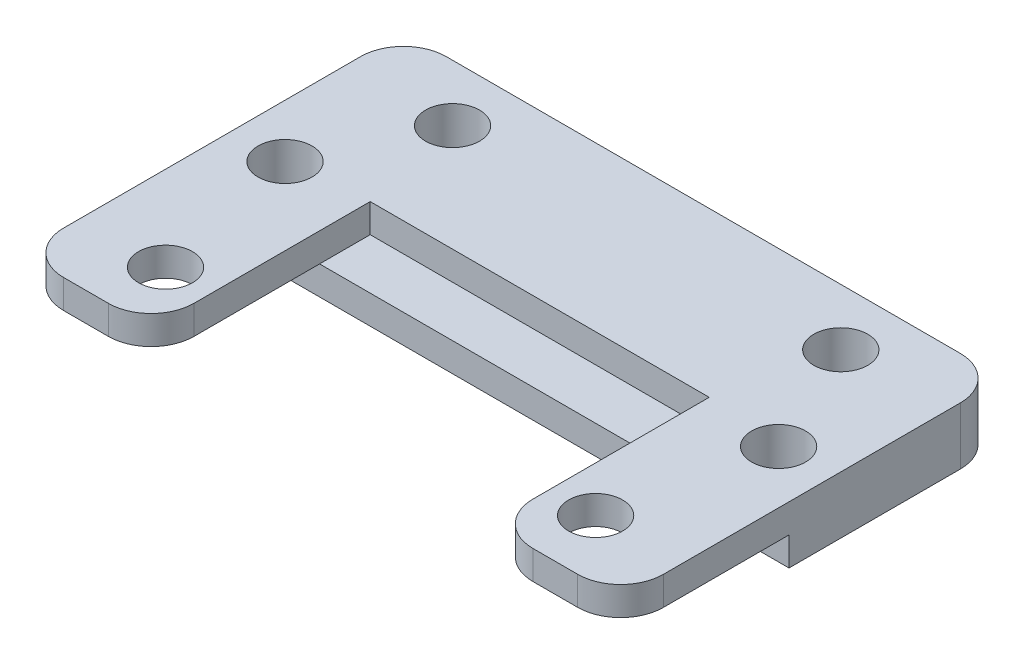
ISO-10303-21;
HEADER;
FILE_DESCRIPTION(('STEP AP214'),'2;1');
FILE_NAME('part.step','',(''),(''),'','','');
FILE_SCHEMA(('AUTOMOTIVE_DESIGN { 1 0 10303 214 1 1 1 1 }'));
ENDSEC;
DATA;
#1=APPLICATION_CONTEXT('core data for automotive mechanical design processes');
#2=APPLICATION_PROTOCOL_DEFINITION('international standard','automotive_design',2000,#1);
#3=PRODUCT_CONTEXT('',#1,'mechanical');
#4=PRODUCT('Part','Part','',(#3));
#5=PRODUCT_RELATED_PRODUCT_CATEGORY('part','',(#4));
#6=PRODUCT_DEFINITION_FORMATION('','',#4);
#7=PRODUCT_DEFINITION_CONTEXT('part definition',#1,'design');
#8=PRODUCT_DEFINITION('design','',#6,#7);
#9=PRODUCT_DEFINITION_SHAPE('','',#8);
#10=(LENGTH_UNIT() NAMED_UNIT(*) SI_UNIT(.MILLI.,.METRE.));
#11=(NAMED_UNIT(*) PLANE_ANGLE_UNIT() SI_UNIT($,.RADIAN.));
#12=(NAMED_UNIT(*) SI_UNIT($,.STERADIAN.) SOLID_ANGLE_UNIT());
#13=UNCERTAINTY_MEASURE_WITH_UNIT(LENGTH_MEASURE(1.E-05),#10,'distance_accuracy_value','');
#14=(GEOMETRIC_REPRESENTATION_CONTEXT(3) GLOBAL_UNCERTAINTY_ASSIGNED_CONTEXT((#13)) GLOBAL_UNIT_ASSIGNED_CONTEXT((#10,
#11,#12)) REPRESENTATION_CONTEXT('',''));
#15=CARTESIAN_POINT('',(0.,0.,0.));
#16=DIRECTION('',(0.,0.,1.));
#17=DIRECTION('',(1.,0.,0.));
#18=AXIS2_PLACEMENT_3D('',#15,#16,#17);
#19=CARTESIAN_POINT('',(83.6251306686558,84.3550258628715,169.432155684648));
#20=DIRECTION('',(0.,0.,-1.));
#21=DIRECTION('',(-1.,0.,0.));
#22=AXIS2_PLACEMENT_3D('',#19,#20,#21);
#23=PLANE('',#22);
#24=DIRECTION('',(-1.,0.,0.));
#25=VECTOR('',#24,1.);
#26=CARTESIAN_POINT('',(119.185130668656,82.6550258628715,169.432155684648));
#27=LINE('',#26,#25);
#28=CARTESIAN_POINT('',(119.185130668656,82.6550258628715,169.432155684648));
#29=VERTEX_POINT('',#28);
#30=CARTESIAN_POINT('',(111.455130668656,82.6550258628715,169.432155684648));
#31=VERTEX_POINT('',#30);
#32=EDGE_CURVE('E186',#29,#31,#27,.T.);
#33=ORIENTED_EDGE('',*,*,#32,.T.);
#34=DIRECTION('',(1.,0.,0.));
#35=VECTOR('',#34,1.);
#36=CARTESIAN_POINT('',(91.3551306686558,82.6550258628715,169.432155684648));
#37=LINE('',#36,#35);
#38=CARTESIAN_POINT('',(91.3551306686558,82.6550258628715,169.432155684648));
#39=VERTEX_POINT('',#38);
#40=EDGE_CURVE('E171',#39,#31,#37,.T.);
#41=ORIENTED_EDGE('',*,*,#40,.F.);
#42=DIRECTION('',(-1.,0.,0.));
#43=VECTOR('',#42,1.);
#44=CARTESIAN_POINT('',(83.6251306686558,82.6550258628715,169.432155684648));
#45=LINE('',#44,#43);
#46=CARTESIAN_POINT('',(83.6251306686558,82.6550258628715,169.432155684648));
#47=VERTEX_POINT('',#46);
#48=EDGE_CURVE('E183',#39,#47,#45,.T.);
#49=ORIENTED_EDGE('',*,*,#48,.T.);
#50=DIRECTION('',(0.,-1.,0.));
#51=VECTOR('',#50,1.);
#52=CARTESIAN_POINT('',(83.6251306686558,84.3550258628715,169.432155684648));
#53=LINE('',#52,#51);
#54=CARTESIAN_POINT('',(83.6251306686558,80.9550258628715,169.432155684648));
#55=VERTEX_POINT('',#54);
#56=EDGE_CURVE('E305',#47,#55,#53,.T.);
#57=ORIENTED_EDGE('',*,*,#56,.T.);
#58=DIRECTION('',(1.,0.,0.));
#59=VECTOR('',#58,1.);
#60=CARTESIAN_POINT('',(83.6251306686558,80.9550258628715,169.432155684648));
#61=LINE('',#60,#59);
#62=CARTESIAN_POINT('',(119.185130668656,80.9550258628715,169.432155684648));
#63=VERTEX_POINT('',#62);
#64=EDGE_CURVE('E271',#55,#63,#61,.T.);
#65=ORIENTED_EDGE('',*,*,#64,.T.);
#66=DIRECTION('',(0.,-1.,0.));
#67=VECTOR('',#66,1.);
#68=CARTESIAN_POINT('',(119.185130668656,84.3550258628715,169.432155684648));
#69=LINE('',#68,#67);
#70=EDGE_CURVE('E283',#29,#63,#69,.T.);
#71=ORIENTED_EDGE('',*,*,#70,.F.);
#72=EDGE_LOOP('',(#33,#41,#49,#57,#65,#71));
#73=FACE_BOUND('',#72,.T.);
#74=ADVANCED_FACE('F45',(#73),#23,.F.);
#75=CARTESIAN_POINT('',(86.1651306686558,84.3550258628715,159.272155684648));
#76=DIRECTION('',(0.,1.,0.));
#77=DIRECTION('',(0.,0.,1.));
#78=AXIS2_PLACEMENT_3D('',#75,#76,#77);
#79=PLANE('',#78);
#80=DIRECTION('',(0.,0.,-1.));
#81=VECTOR('',#80,1.);
#82=CARTESIAN_POINT('',(91.3551306686558,84.3550258628715,169.432155684648));
#83=LINE('',#82,#81);
#84=CARTESIAN_POINT('',(91.3551306686558,84.3550258628715,176.877155684648));
#85=VERTEX_POINT('',#84);
#86=CARTESIAN_POINT('',(91.3551306686558,84.3550258628715,166.432155684648));
#87=VERTEX_POINT('',#86);
#88=EDGE_CURVE('E223',#85,#87,#83,.T.);
#89=ORIENTED_EDGE('',*,*,#88,.T.);
#90=DIRECTION('',(-1.,0.,0.));
#91=VECTOR('',#90,1.);
#92=CARTESIAN_POINT('',(91.3551306686558,84.3550258628715,166.432155684648));
#93=LINE('',#92,#91);
#94=CARTESIAN_POINT('',(111.455130668656,84.3550258628715,166.432155684648));
#95=VERTEX_POINT('',#94);
#96=EDGE_CURVE('E179',#95,#87,#93,.T.);
#97=ORIENTED_EDGE('',*,*,#96,.F.);
#98=DIRECTION('',(0.,0.,1.));
#99=VECTOR('',#98,1.);
#100=CARTESIAN_POINT('',(111.455130668656,84.3550258628715,169.432155684648));
#101=LINE('',#100,#99);
#102=CARTESIAN_POINT('',(111.455130668656,84.3550258628715,176.877155684647));
#103=VERTEX_POINT('',#102);
#104=EDGE_CURVE('E633',#95,#103,#101,.T.);
#105=ORIENTED_EDGE('',*,*,#104,.T.);
#106=CARTESIAN_POINT('',(113.995130668656,84.3550258628715,176.877155684647));
#107=DIRECTION('',(0.,1.,0.));
#108=DIRECTION('',(0.,0.,-1.));
#109=AXIS2_PLACEMENT_3D('',#106,#107,#108);
#110=CIRCLE('',#109,2.53999999999999);
#111=CARTESIAN_POINT('',(113.995130668656,84.3550258628715,179.417155684647));
#112=VERTEX_POINT('',#111);
#113=EDGE_CURVE('E661',#103,#112,#110,.T.);
#114=ORIENTED_EDGE('',*,*,#113,.T.);
#115=DIRECTION('',(1.,0.,0.));
#116=VECTOR('',#115,1.);
#117=CARTESIAN_POINT('',(116.645130668656,84.3550258628715,179.417155684647));
#118=LINE('',#117,#116);
#119=CARTESIAN_POINT('',(116.645130668656,84.3550258628715,179.417155684647));
#120=VERTEX_POINT('',#119);
#121=EDGE_CURVE('E665',#112,#120,#118,.T.);
#122=ORIENTED_EDGE('',*,*,#121,.T.);
#123=CARTESIAN_POINT('',(116.645130668656,84.3550258628715,176.877155684647));
#124=DIRECTION('',(0.,1.,0.));
#125=DIRECTION('',(0.,0.,-1.));
#126=AXIS2_PLACEMENT_3D('',#123,#124,#125);
#127=CIRCLE('',#126,2.53999999999999);
#128=CARTESIAN_POINT('',(119.185130668656,84.3550258628715,176.877155684647));
#129=VERTEX_POINT('',#128);
#130=EDGE_CURVE('E638',#120,#129,#127,.T.);
#131=ORIENTED_EDGE('',*,*,#130,.T.);
#132=DIRECTION('',(0.,0.,-1.));
#133=VECTOR('',#132,1.);
#134=CARTESIAN_POINT('',(119.185130668656,84.3550258628715,159.272155684648));
#135=LINE('',#134,#133);
#136=CARTESIAN_POINT('',(119.185130668656,84.3550258628715,159.272155684648));
#137=VERTEX_POINT('',#136);
#138=EDGE_CURVE('E266',#129,#137,#135,.T.);
#139=ORIENTED_EDGE('',*,*,#138,.T.);
#140=CARTESIAN_POINT('',(116.645130668656,84.3550258628715,159.272155684648));
#141=DIRECTION('',(0.,1.,0.));
#142=DIRECTION('',(0.,0.,-1.));
#143=AXIS2_PLACEMENT_3D('',#140,#141,#142);
#144=CIRCLE('',#143,2.53999999999999);
#145=CARTESIAN_POINT('',(116.645130668656,84.3550258628715,156.732155684648));
#146=VERTEX_POINT('',#145);
#147=EDGE_CURVE('E270',#137,#146,#144,.T.);
#148=ORIENTED_EDGE('',*,*,#147,.T.);
#149=DIRECTION('',(-1.,0.,0.));
#150=VECTOR('',#149,1.);
#151=CARTESIAN_POINT('',(86.1651306686558,84.3550258628715,156.732155684648));
#152=LINE('',#151,#150);
#153=CARTESIAN_POINT('',(86.1651306686558,84.3550258628715,156.732155684648));
#154=VERTEX_POINT('',#153);
#155=EDGE_CURVE('E274',#146,#154,#152,.T.);
#156=ORIENTED_EDGE('',*,*,#155,.T.);
#157=CARTESIAN_POINT('',(86.1651306686558,84.3550258628715,159.272155684648));
#158=DIRECTION('',(0.,1.,0.));
#159=DIRECTION('',(0.,0.,1.));
#160=AXIS2_PLACEMENT_3D('',#157,#158,#159);
#161=CIRCLE('',#160,2.53999999999999);
#162=CARTESIAN_POINT('',(83.6251306686558,84.3550258628715,159.272155684648));
#163=VERTEX_POINT('',#162);
#164=EDGE_CURVE('E277',#154,#163,#161,.T.);
#165=ORIENTED_EDGE('',*,*,#164,.T.);
#166=DIRECTION('',(0.,0.,1.));
#167=VECTOR('',#166,1.);
#168=CARTESIAN_POINT('',(83.6251306686558,84.3550258628715,159.272155684648));
#169=LINE('',#168,#167);
#170=CARTESIAN_POINT('',(83.6251306686558,84.3550258628715,176.877155684648));
#171=VERTEX_POINT('',#170);
#172=EDGE_CURVE('E280',#163,#171,#169,.T.);
#173=ORIENTED_EDGE('',*,*,#172,.T.);
#174=CARTESIAN_POINT('',(86.1651306686558,84.3550258628715,176.877155684648));
#175=DIRECTION('',(0.,1.,0.));
#176=DIRECTION('',(0.,0.,1.));
#177=AXIS2_PLACEMENT_3D('',#174,#175,#176);
#178=CIRCLE('',#177,2.53999999999999);
#179=CARTESIAN_POINT('',(86.1651306686558,84.3550258628715,179.417155684648));
#180=VERTEX_POINT('',#179);
#181=EDGE_CURVE('E210',#171,#180,#178,.T.);
#182=ORIENTED_EDGE('',*,*,#181,.T.);
#183=DIRECTION('',(1.,0.,0.));
#184=VECTOR('',#183,1.);
#185=CARTESIAN_POINT('',(86.1651306686558,84.3550258628715,179.417155684648));
#186=LINE('',#185,#184);
#187=CARTESIAN_POINT('',(88.8151306686558,84.3550258628715,179.417155684648));
#188=VERTEX_POINT('',#187);
#189=EDGE_CURVE('E214',#180,#188,#186,.T.);
#190=ORIENTED_EDGE('',*,*,#189,.T.);
#191=CARTESIAN_POINT('',(88.8151306686558,84.3550258628715,176.877155684648));
#192=DIRECTION('',(0.,1.,0.));
#193=DIRECTION('',(0.,0.,1.));
#194=AXIS2_PLACEMENT_3D('',#191,#192,#193);
#195=CIRCLE('',#194,2.53999999999999);
#196=EDGE_CURVE('E219',#188,#85,#195,.T.);
#197=ORIENTED_EDGE('',*,*,#196,.T.);
#198=EDGE_LOOP('',(#89,#97,#105,#114,#122,#131,#139,#148,#156,#165,#173,#182,#190,#197));
#199=FACE_BOUND('',#198,.T.);
#200=CARTESIAN_POINT('',(89.8955117254591,84.3550258628715,160.09007966282));
#201=DIRECTION('',(0.,1.,0.));
#202=DIRECTION('',(0.,0.,1.));
#203=AXIS2_PLACEMENT_3D('',#200,#201,#202);
#204=CIRCLE('',#203,1.60000000000002);
#205=CARTESIAN_POINT('',(89.8955117254591,84.3550258628715,161.69007966282));
#206=VERTEX_POINT('',#205);
#207=EDGE_CURVE('E242',#206,#206,#204,.T.);
#208=ORIENTED_EDGE('',*,*,#207,.F.);
#209=EDGE_LOOP('',(#208));
#210=FACE_BOUND('',#209,.T.);
#211=CARTESIAN_POINT('',(116.036904819902,84.3550258628715,166.898975693062));
#212=DIRECTION('',(0.,1.,0.));
#213=DIRECTION('',(0.,0.,1.));
#214=AXIS2_PLACEMENT_3D('',#211,#212,#213);
#215=CIRCLE('',#214,1.59999999999999);
#216=CARTESIAN_POINT('',(116.036904819902,84.3550258628715,168.498975693062));
#217=VERTEX_POINT('',#216);
#218=EDGE_CURVE('E258',#217,#217,#215,.T.);
#219=ORIENTED_EDGE('',*,*,#218,.F.);
#220=EDGE_LOOP('',(#219));
#221=FACE_BOUND('',#220,.T.);
#222=CARTESIAN_POINT('',(112.914749611926,84.3550258628715,160.09007966282));
#223=DIRECTION('',(0.,1.,0.));
#224=DIRECTION('',(0.,0.,1.));
#225=AXIS2_PLACEMENT_3D('',#222,#223,#224);
#226=CIRCLE('',#225,1.60000000000002);
#227=CARTESIAN_POINT('',(112.914749611926,84.3550258628715,161.69007966282));
#228=VERTEX_POINT('',#227);
#229=EDGE_CURVE('E250',#228,#228,#226,.T.);
#230=ORIENTED_EDGE('',*,*,#229,.F.);
#231=EDGE_LOOP('',(#230));
#232=FACE_BOUND('',#231,.T.);
#233=CARTESIAN_POINT('',(86.7733565174829,84.3550258628715,166.898975693063));
#234=DIRECTION('',(0.,1.,0.));
#235=DIRECTION('',(0.,0.,1.));
#236=AXIS2_PLACEMENT_3D('',#233,#234,#235);
#237=CIRCLE('',#236,1.59999999999999);
#238=CARTESIAN_POINT('',(86.7733565174829,84.3550258628715,168.498975693063));
#239=VERTEX_POINT('',#238);
#240=EDGE_CURVE('E234',#239,#239,#237,.T.);
#241=ORIENTED_EDGE('',*,*,#240,.F.);
#242=EDGE_LOOP('',(#241));
#243=FACE_BOUND('',#242,.T.);
#244=CARTESIAN_POINT('',(88.6551306686557,84.3550258628715,175.867155684648));
#245=DIRECTION('',(0.,1.,0.));
#246=DIRECTION('',(0.,0.,1.));
#247=AXIS2_PLACEMENT_3D('',#244,#245,#246);
#248=CIRCLE('',#247,1.59999999999999);
#249=CARTESIAN_POINT('',(88.6551306686557,84.3550258628715,177.467155684648));
#250=VERTEX_POINT('',#249);
#251=EDGE_CURVE('E353',#250,#250,#248,.T.);
#252=ORIENTED_EDGE('',*,*,#251,.F.);
#253=EDGE_LOOP('',(#252));
#254=FACE_BOUND('',#253,.T.);
#255=CARTESIAN_POINT('',(114.155130668656,84.3550258628715,175.867155684648));
#256=DIRECTION('',(0.,1.,0.));
#257=DIRECTION('',(0.,0.,1.));
#258=AXIS2_PLACEMENT_3D('',#255,#256,#257);
#259=CIRCLE('',#258,1.6);
#260=CARTESIAN_POINT('',(114.155130668656,84.3550258628715,177.467155684648));
#261=VERTEX_POINT('',#260);
#262=EDGE_CURVE('E623',#261,#261,#259,.T.);
#263=ORIENTED_EDGE('',*,*,#262,.F.);
#264=EDGE_LOOP('',(#263));
#265=FACE_BOUND('',#264,.T.);
#266=ADVANCED_FACE('F340',(#199,#210,#221,#232,#243,#254,#265),#79,.T.);
#267=CARTESIAN_POINT('',(86.1651306686558,80.9550258628715,159.272155684648));
#268=DIRECTION('',(0.,1.,0.));
#269=DIRECTION('',(0.,0.,1.));
#270=AXIS2_PLACEMENT_3D('',#267,#268,#269);
#271=PLANE('',#270);
#272=DIRECTION('',(0.,0.,-1.));
#273=VECTOR('',#272,1.);
#274=CARTESIAN_POINT('',(119.185130668656,80.9550258628715,159.272155684648));
#275=LINE('',#274,#273);
#276=CARTESIAN_POINT('',(119.185130668656,80.9550258628715,159.272155684648));
#277=VERTEX_POINT('',#276);
#278=EDGE_CURVE('E262',#63,#277,#275,.T.);
#279=ORIENTED_EDGE('',*,*,#278,.F.);
#280=ORIENTED_EDGE('',*,*,#64,.F.);
#281=DIRECTION('',(0.,0.,1.));
#282=VECTOR('',#281,1.);
#283=CARTESIAN_POINT('',(83.6251306686558,80.9550258628715,159.272155684648));
#284=LINE('',#283,#282);
#285=CARTESIAN_POINT('',(83.6251306686558,80.9550258628715,159.272155684648));
#286=VERTEX_POINT('',#285);
#287=EDGE_CURVE('E296',#286,#55,#284,.T.);
#288=ORIENTED_EDGE('',*,*,#287,.F.);
#289=CARTESIAN_POINT('',(86.1651306686558,80.9550258628715,159.272155684648));
#290=DIRECTION('',(0.,1.,0.));
#291=DIRECTION('',(0.,0.,1.));
#292=AXIS2_PLACEMENT_3D('',#289,#290,#291);
#293=CIRCLE('',#292,2.53999999999999);
#294=CARTESIAN_POINT('',(86.1651306686558,80.9550258628715,156.732155684648));
#295=VERTEX_POINT('',#294);
#296=EDGE_CURVE('E293',#295,#286,#293,.T.);
#297=ORIENTED_EDGE('',*,*,#296,.F.);
#298=DIRECTION('',(-1.,0.,0.));
#299=VECTOR('',#298,1.);
#300=CARTESIAN_POINT('',(86.1651306686558,80.9550258628715,156.732155684648));
#301=LINE('',#300,#299);
#302=CARTESIAN_POINT('',(116.645130668656,80.9550258628715,156.732155684648));
#303=VERTEX_POINT('',#302);
#304=EDGE_CURVE('E290',#303,#295,#301,.T.);
#305=ORIENTED_EDGE('',*,*,#304,.F.);
#306=CARTESIAN_POINT('',(116.645130668656,80.9550258628715,159.272155684648));
#307=DIRECTION('',(0.,1.,0.));
#308=DIRECTION('',(0.,0.,-1.));
#309=AXIS2_PLACEMENT_3D('',#306,#307,#308);
#310=CIRCLE('',#309,2.53999999999999);
#311=EDGE_CURVE('E287',#277,#303,#310,.T.);
#312=ORIENTED_EDGE('',*,*,#311,.F.);
#313=EDGE_LOOP('',(#279,#280,#288,#297,#305,#312));
#314=FACE_BOUND('',#313,.T.);
#315=CARTESIAN_POINT('',(116.036904819902,80.9550258628715,166.898975693062));
#316=DIRECTION('',(0.,1.,0.));
#317=DIRECTION('',(0.,0.,1.));
#318=AXIS2_PLACEMENT_3D('',#315,#316,#317);
#319=CIRCLE('',#318,1.59999999999999);
#320=CARTESIAN_POINT('',(116.036904819902,80.9550258628715,168.498975693062));
#321=VERTEX_POINT('',#320);
#322=EDGE_CURVE('E254',#321,#321,#319,.T.);
#323=ORIENTED_EDGE('',*,*,#322,.T.);
#324=EDGE_LOOP('',(#323));
#325=FACE_BOUND('',#324,.T.);
#326=CARTESIAN_POINT('',(112.914749611926,80.9550258628715,160.09007966282));
#327=DIRECTION('',(0.,1.,0.));
#328=DIRECTION('',(0.,0.,1.));
#329=AXIS2_PLACEMENT_3D('',#326,#327,#328);
#330=CIRCLE('',#329,1.60000000000002);
#331=CARTESIAN_POINT('',(112.914749611926,80.9550258628715,161.69007966282));
#332=VERTEX_POINT('',#331);
#333=EDGE_CURVE('E246',#332,#332,#330,.T.);
#334=ORIENTED_EDGE('',*,*,#333,.T.);
#335=EDGE_LOOP('',(#334));
#336=FACE_BOUND('',#335,.T.);
#337=CARTESIAN_POINT('',(89.8955117254591,80.9550258628715,160.09007966282));
#338=DIRECTION('',(0.,1.,0.));
#339=DIRECTION('',(0.,0.,1.));
#340=AXIS2_PLACEMENT_3D('',#337,#338,#339);
#341=CIRCLE('',#340,1.60000000000002);
#342=CARTESIAN_POINT('',(89.8955117254591,80.9550258628715,161.69007966282));
#343=VERTEX_POINT('',#342);
#344=EDGE_CURVE('E238',#343,#343,#341,.T.);
#345=ORIENTED_EDGE('',*,*,#344,.T.);
#346=EDGE_LOOP('',(#345));
#347=FACE_BOUND('',#346,.T.);
#348=CARTESIAN_POINT('',(86.7733565174829,80.9550258628715,166.898975693063));
#349=DIRECTION('',(0.,1.,0.));
#350=DIRECTION('',(0.,0.,1.));
#351=AXIS2_PLACEMENT_3D('',#348,#349,#350);
#352=CIRCLE('',#351,1.59999999999999);
#353=CARTESIAN_POINT('',(86.7733565174829,80.9550258628715,168.498975693063));
#354=VERTEX_POINT('',#353);
#355=EDGE_CURVE('E228',#354,#354,#352,.T.);
#356=ORIENTED_EDGE('',*,*,#355,.T.);
#357=EDGE_LOOP('',(#356));
#358=FACE_BOUND('',#357,.T.);
#359=ADVANCED_FACE('F327',(#314,#325,#336,#347,#358),#271,.F.);
#360=CARTESIAN_POINT('',(119.185130668656,84.3550258628715,159.272155684648));
#361=DIRECTION('',(-1.,0.,0.));
#362=DIRECTION('',(0.,0.,1.));
#363=AXIS2_PLACEMENT_3D('',#360,#361,#362);
#364=PLANE('',#363);
#365=ORIENTED_EDGE('',*,*,#278,.T.);
#366=DIRECTION('',(0.,-1.,0.));
#367=VECTOR('',#366,1.);
#368=CARTESIAN_POINT('',(119.185130668656,84.3550258628715,159.272155684648));
#369=LINE('',#368,#367);
#370=EDGE_CURVE('E11',#137,#277,#369,.T.);
#371=ORIENTED_EDGE('',*,*,#370,.F.);
#372=ORIENTED_EDGE('',*,*,#138,.F.);
#373=DIRECTION('',(0.,1.,0.));
#374=VECTOR('',#373,1.);
#375=CARTESIAN_POINT('',(119.185130668656,82.6550258628715,176.877155684647));
#376=LINE('',#375,#374);
#377=CARTESIAN_POINT('',(119.185130668656,82.6550258628715,176.877155684647));
#378=VERTEX_POINT('',#377);
#379=EDGE_CURVE('E671',#378,#129,#376,.T.);
#380=ORIENTED_EDGE('',*,*,#379,.F.);
#381=DIRECTION('',(0.,0.,-1.));
#382=VECTOR('',#381,1.);
#383=CARTESIAN_POINT('',(119.185130668656,82.6550258628715,169.432155684648));
#384=LINE('',#383,#382);
#385=EDGE_CURVE('E61',#378,#29,#384,.T.);
#386=ORIENTED_EDGE('',*,*,#385,.T.);
#387=ORIENTED_EDGE('',*,*,#70,.T.);
#388=EDGE_LOOP('',(#365,#371,#372,#380,#386,#387));
#389=FACE_BOUND('',#388,.T.);
#390=ADVANCED_FACE('F47',(#389),#364,.F.);
#391=CARTESIAN_POINT('',(116.645130668656,84.3550258628715,159.272155684648));
#392=DIRECTION('',(0.,-1.,0.));
#393=DIRECTION('',(0.,0.,-1.));
#394=AXIS2_PLACEMENT_3D('',#391,#392,#393);
#395=CYLINDRICAL_SURFACE('',#394,2.53999999999999);
#396=ORIENTED_EDGE('',*,*,#311,.T.);
#397=DIRECTION('',(0.,-1.,0.));
#398=VECTOR('',#397,1.);
#399=CARTESIAN_POINT('',(116.645130668656,84.3550258628715,156.732155684648));
#400=LINE('',#399,#398);
#401=EDGE_CURVE('E54',#146,#303,#400,.T.);
#402=ORIENTED_EDGE('',*,*,#401,.F.);
#403=ORIENTED_EDGE('',*,*,#147,.F.);
#404=ORIENTED_EDGE('',*,*,#370,.T.);
#405=EDGE_LOOP('',(#396,#402,#403,#404));
#406=FACE_BOUND('',#405,.T.);
#407=ADVANCED_FACE('F344',(#406),#395,.T.);
#408=CARTESIAN_POINT('',(86.1651306686558,84.3550258628715,156.732155684648));
#409=DIRECTION('',(0.,0.,1.));
#410=DIRECTION('',(1.,0.,0.));
#411=AXIS2_PLACEMENT_3D('',#408,#409,#410);
#412=PLANE('',#411);
#413=ORIENTED_EDGE('',*,*,#304,.T.);
#414=DIRECTION('',(0.,-1.,0.));
#415=VECTOR('',#414,1.);
#416=CARTESIAN_POINT('',(86.1651306686558,84.3550258628715,156.732155684648));
#417=LINE('',#416,#415);
#418=EDGE_CURVE('E312',#154,#295,#417,.T.);
#419=ORIENTED_EDGE('',*,*,#418,.F.);
#420=ORIENTED_EDGE('',*,*,#155,.F.);
#421=ORIENTED_EDGE('',*,*,#401,.T.);
#422=EDGE_LOOP('',(#413,#419,#420,#421));
#423=FACE_BOUND('',#422,.T.);
#424=ADVANCED_FACE('F321',(#423),#412,.F.);
#425=CARTESIAN_POINT('',(86.1651306686558,84.3550258628715,159.272155684648));
#426=DIRECTION('',(0.,-1.,0.));
#427=DIRECTION('',(0.,0.,-1.));
#428=AXIS2_PLACEMENT_3D('',#425,#426,#427);
#429=CYLINDRICAL_SURFACE('',#428,2.53999999999999);
#430=ORIENTED_EDGE('',*,*,#296,.T.);
#431=DIRECTION('',(0.,-1.,0.));
#432=VECTOR('',#431,1.);
#433=CARTESIAN_POINT('',(83.6251306686558,84.3550258628715,159.272155684648));
#434=LINE('',#433,#432);
#435=EDGE_CURVE('E308',#163,#286,#434,.T.);
#436=ORIENTED_EDGE('',*,*,#435,.F.);
#437=ORIENTED_EDGE('',*,*,#164,.F.);
#438=ORIENTED_EDGE('',*,*,#418,.T.);
#439=EDGE_LOOP('',(#430,#436,#437,#438));
#440=FACE_BOUND('',#439,.T.);
#441=ADVANCED_FACE('F333',(#440),#429,.T.);
#442=CARTESIAN_POINT('',(83.6251306686558,84.3550258628715,159.272155684648));
#443=DIRECTION('',(1.,0.,0.));
#444=DIRECTION('',(0.,0.,-1.));
#445=AXIS2_PLACEMENT_3D('',#442,#443,#444);
#446=PLANE('',#445);
#447=ORIENTED_EDGE('',*,*,#287,.T.);
#448=ORIENTED_EDGE('',*,*,#56,.F.);
#449=DIRECTION('',(0.,0.,1.));
#450=VECTOR('',#449,1.);
#451=CARTESIAN_POINT('',(83.6251306686558,82.6550258628715,169.432155684648));
#452=LINE('',#451,#450);
#453=CARTESIAN_POINT('',(83.6251306686558,82.6550258628715,176.877155684648));
#454=VERTEX_POINT('',#453);
#455=EDGE_CURVE('E69',#47,#454,#452,.T.);
#456=ORIENTED_EDGE('',*,*,#455,.T.);
#457=DIRECTION('',(0.,1.,0.));
#458=VECTOR('',#457,1.);
#459=CARTESIAN_POINT('',(83.6251306686558,82.6550258628715,176.877155684648));
#460=LINE('',#459,#458);
#461=EDGE_CURVE('E202',#454,#171,#460,.T.);
#462=ORIENTED_EDGE('',*,*,#461,.T.);
#463=ORIENTED_EDGE('',*,*,#172,.F.);
#464=ORIENTED_EDGE('',*,*,#435,.T.);
#465=EDGE_LOOP('',(#447,#448,#456,#462,#463,#464));
#466=FACE_BOUND('',#465,.T.);
#467=ADVANCED_FACE('F337',(#466),#446,.F.);
#468=CARTESIAN_POINT('',(116.036904819902,84.3550258628715,166.898975693062));
#469=DIRECTION('',(0.,-1.,0.));
#470=DIRECTION('',(0.,0.,-1.));
#471=AXIS2_PLACEMENT_3D('',#468,#469,#470);
#472=CYLINDRICAL_SURFACE('',#471,1.59999999999999);
#473=ORIENTED_EDGE('',*,*,#218,.T.);
#474=EDGE_LOOP('',(#473));
#475=FACE_BOUND('',#474,.T.);
#476=ORIENTED_EDGE('',*,*,#322,.F.);
#477=EDGE_LOOP('',(#476));
#478=FACE_BOUND('',#477,.T.);
#479=ADVANCED_FACE('F391',(#475,#478),#472,.F.);
#480=CARTESIAN_POINT('',(112.914749611926,84.3550258628715,160.09007966282));
#481=DIRECTION('',(0.,-1.,0.));
#482=DIRECTION('',(0.,0.,-1.));
#483=AXIS2_PLACEMENT_3D('',#480,#481,#482);
#484=CYLINDRICAL_SURFACE('',#483,1.60000000000002);
#485=ORIENTED_EDGE('',*,*,#229,.T.);
#486=EDGE_LOOP('',(#485));
#487=FACE_BOUND('',#486,.T.);
#488=ORIENTED_EDGE('',*,*,#333,.F.);
#489=EDGE_LOOP('',(#488));
#490=FACE_BOUND('',#489,.T.);
#491=ADVANCED_FACE('F453',(#487,#490),#484,.F.);
#492=CARTESIAN_POINT('',(89.8955117254591,84.3550258628715,160.09007966282));
#493=DIRECTION('',(0.,-1.,0.));
#494=DIRECTION('',(0.,0.,-1.));
#495=AXIS2_PLACEMENT_3D('',#492,#493,#494);
#496=CYLINDRICAL_SURFACE('',#495,1.60000000000002);
#497=ORIENTED_EDGE('',*,*,#207,.T.);
#498=EDGE_LOOP('',(#497));
#499=FACE_BOUND('',#498,.T.);
#500=ORIENTED_EDGE('',*,*,#344,.F.);
#501=EDGE_LOOP('',(#500));
#502=FACE_BOUND('',#501,.T.);
#503=ADVANCED_FACE('F463',(#499,#502),#496,.F.);
#504=CARTESIAN_POINT('',(86.7733565174829,84.3550258628715,166.898975693063));
#505=DIRECTION('',(0.,-1.,0.));
#506=DIRECTION('',(0.,0.,-1.));
#507=AXIS2_PLACEMENT_3D('',#504,#505,#506);
#508=CYLINDRICAL_SURFACE('',#507,1.59999999999999);
#509=ORIENTED_EDGE('',*,*,#240,.T.);
#510=EDGE_LOOP('',(#509));
#511=FACE_BOUND('',#510,.T.);
#512=ORIENTED_EDGE('',*,*,#355,.F.);
#513=EDGE_LOOP('',(#512));
#514=FACE_BOUND('',#513,.T.);
#515=ADVANCED_FACE('F473',(#511,#514),#508,.F.);
#516=CARTESIAN_POINT('',(91.3551306686558,82.6550258628715,169.432155684648));
#517=DIRECTION('',(1.,0.,0.));
#518=DIRECTION('',(0.,0.,-1.));
#519=AXIS2_PLACEMENT_3D('',#516,#517,#518);
#520=PLANE('',#519);
#521=ORIENTED_EDGE('',*,*,#88,.F.);
#522=DIRECTION('',(0.,1.,0.));
#523=VECTOR('',#522,1.);
#524=CARTESIAN_POINT('',(91.3551306686558,82.6550258628715,176.877155684648));
#525=LINE('',#524,#523);
#526=CARTESIAN_POINT('',(91.3551306686558,82.6550258628715,176.877155684648));
#527=VERTEX_POINT('',#526);
#528=EDGE_CURVE('E194',#527,#85,#525,.T.);
#529=ORIENTED_EDGE('',*,*,#528,.F.);
#530=DIRECTION('',(0.,0.,-1.));
#531=VECTOR('',#530,1.);
#532=CARTESIAN_POINT('',(91.3551306686558,82.6550258628715,169.432155684648));
#533=LINE('',#532,#531);
#534=EDGE_CURVE('E191',#527,#39,#533,.T.);
#535=ORIENTED_EDGE('',*,*,#534,.T.);
#536=DIRECTION('',(0.,0.,1.));
#537=VECTOR('',#536,1.);
#538=CARTESIAN_POINT('',(91.3551306686558,82.6550258628715,169.432155684648));
#539=LINE('',#538,#537);
#540=CARTESIAN_POINT('',(91.3551306686558,82.6550258628715,166.432155684648));
#541=VERTEX_POINT('',#540);
#542=EDGE_CURVE('E167',#541,#39,#539,.T.);
#543=ORIENTED_EDGE('',*,*,#542,.F.);
#544=DIRECTION('',(0.,1.,0.));
#545=VECTOR('',#544,1.);
#546=CARTESIAN_POINT('',(91.3551306686558,82.6550258628715,166.432155684648));
#547=LINE('',#546,#545);
#548=EDGE_CURVE('E676',#541,#87,#547,.T.);
#549=ORIENTED_EDGE('',*,*,#548,.T.);
#550=EDGE_LOOP('',(#521,#529,#535,#543,#549));
#551=FACE_BOUND('',#550,.T.);
#552=ADVANCED_FACE('F193',(#551),#520,.T.);
#553=CARTESIAN_POINT('',(88.8151306686558,82.6550258628715,176.877155684648));
#554=DIRECTION('',(0.,1.,0.));
#555=DIRECTION('',(0.,0.,1.));
#556=AXIS2_PLACEMENT_3D('',#553,#554,#555);
#557=CYLINDRICAL_SURFACE('',#556,2.53999999999999);
#558=ORIENTED_EDGE('',*,*,#196,.F.);
#559=DIRECTION('',(0.,1.,0.));
#560=VECTOR('',#559,1.);
#561=CARTESIAN_POINT('',(88.8151306686558,82.6550258628715,179.417155684648));
#562=LINE('',#561,#560);
#563=CARTESIAN_POINT('',(88.8151306686558,82.6550258628715,179.417155684648));
#564=VERTEX_POINT('',#563);
#565=EDGE_CURVE('E229',#564,#188,#562,.T.);
#566=ORIENTED_EDGE('',*,*,#565,.F.);
#567=CARTESIAN_POINT('',(88.8151306686558,82.6550258628715,176.877155684648));
#568=DIRECTION('',(0.,1.,0.));
#569=DIRECTION('',(0.,0.,1.));
#570=AXIS2_PLACEMENT_3D('',#567,#568,#569);
#571=CIRCLE('',#570,2.53999999999999);
#572=EDGE_CURVE('E198',#564,#527,#571,.T.);
#573=ORIENTED_EDGE('',*,*,#572,.T.);
#574=ORIENTED_EDGE('',*,*,#528,.T.);
#575=EDGE_LOOP('',(#558,#566,#573,#574));
#576=FACE_BOUND('',#575,.T.);
#577=ADVANCED_FACE('F361',(#576),#557,.T.);
#578=CARTESIAN_POINT('',(86.1651306686558,82.6550258628715,179.417155684648));
#579=DIRECTION('',(0.,0.,1.));
#580=DIRECTION('',(1.,0.,0.));
#581=AXIS2_PLACEMENT_3D('',#578,#579,#580);
#582=PLANE('',#581);
#583=ORIENTED_EDGE('',*,*,#189,.F.);
#584=DIRECTION('',(0.,1.,0.));
#585=VECTOR('',#584,1.);
#586=CARTESIAN_POINT('',(86.1651306686558,82.6550258628715,179.417155684648));
#587=LINE('',#586,#585);
#588=CARTESIAN_POINT('',(86.1651306686558,82.6550258628715,179.417155684648));
#589=VERTEX_POINT('',#588);
#590=EDGE_CURVE('E206',#589,#180,#587,.T.);
#591=ORIENTED_EDGE('',*,*,#590,.F.);
#592=DIRECTION('',(1.,0.,0.));
#593=VECTOR('',#592,1.);
#594=CARTESIAN_POINT('',(86.1651306686558,82.6550258628715,179.417155684648));
#595=LINE('',#594,#593);
#596=EDGE_CURVE('E350',#589,#564,#595,.T.);
#597=ORIENTED_EDGE('',*,*,#596,.T.);
#598=ORIENTED_EDGE('',*,*,#565,.T.);
#599=EDGE_LOOP('',(#583,#591,#597,#598));
#600=FACE_BOUND('',#599,.T.);
#601=ADVANCED_FACE('F365',(#600),#582,.T.);
#602=CARTESIAN_POINT('',(86.1651306686558,82.6550258628715,176.877155684648));
#603=DIRECTION('',(0.,1.,0.));
#604=DIRECTION('',(0.,0.,1.));
#605=AXIS2_PLACEMENT_3D('',#602,#603,#604);
#606=CYLINDRICAL_SURFACE('',#605,2.53999999999999);
#607=ORIENTED_EDGE('',*,*,#181,.F.);
#608=ORIENTED_EDGE('',*,*,#461,.F.);
#609=CARTESIAN_POINT('',(86.1651306686558,82.6550258628715,176.877155684648));
#610=DIRECTION('',(0.,1.,0.));
#611=DIRECTION('',(0.,0.,1.));
#612=AXIS2_PLACEMENT_3D('',#609,#610,#611);
#613=CIRCLE('',#612,2.53999999999999);
#614=EDGE_CURVE('E346',#454,#589,#613,.T.);
#615=ORIENTED_EDGE('',*,*,#614,.T.);
#616=ORIENTED_EDGE('',*,*,#590,.T.);
#617=EDGE_LOOP('',(#607,#608,#615,#616));
#618=FACE_BOUND('',#617,.T.);
#619=ADVANCED_FACE('F367',(#618),#606,.T.);
#620=CARTESIAN_POINT('',(86.1651306686558,82.6550258628715,176.877155684648));
#621=DIRECTION('',(0.,1.,0.));
#622=DIRECTION('',(0.,0.,1.));
#623=AXIS2_PLACEMENT_3D('',#620,#621,#622);
#624=PLANE('',#623);
#625=CARTESIAN_POINT('',(88.6551306686557,82.6550258628715,175.867155684648));
#626=DIRECTION('',(0.,1.,0.));
#627=DIRECTION('',(0.,0.,1.));
#628=AXIS2_PLACEMENT_3D('',#625,#626,#627);
#629=CIRCLE('',#628,1.59999999999999);
#630=CARTESIAN_POINT('',(88.6551306686557,82.6550258628715,177.467155684648));
#631=VERTEX_POINT('',#630);
#632=EDGE_CURVE('E215',#631,#631,#629,.T.);
#633=ORIENTED_EDGE('',*,*,#632,.T.);
#634=EDGE_LOOP('',(#633));
#635=FACE_BOUND('',#634,.T.);
#636=ORIENTED_EDGE('',*,*,#455,.F.);
#637=ORIENTED_EDGE('',*,*,#48,.F.);
#638=ORIENTED_EDGE('',*,*,#534,.F.);
#639=ORIENTED_EDGE('',*,*,#572,.F.);
#640=ORIENTED_EDGE('',*,*,#596,.F.);
#641=ORIENTED_EDGE('',*,*,#614,.F.);
#642=EDGE_LOOP('',(#636,#637,#638,#639,#640,#641));
#643=FACE_BOUND('',#642,.T.);
#644=ADVANCED_FACE('F200',(#635,#643),#624,.F.);
#645=CARTESIAN_POINT('',(88.6551306686557,82.6550258628715,175.867155684648));
#646=DIRECTION('',(0.,1.,0.));
#647=DIRECTION('',(0.,0.,1.));
#648=AXIS2_PLACEMENT_3D('',#645,#646,#647);
#649=CYLINDRICAL_SURFACE('',#648,1.59999999999999);
#650=ORIENTED_EDGE('',*,*,#632,.F.);
#651=EDGE_LOOP('',(#650));
#652=FACE_BOUND('',#651,.T.);
#653=ORIENTED_EDGE('',*,*,#251,.T.);
#654=EDGE_LOOP('',(#653));
#655=FACE_BOUND('',#654,.T.);
#656=ADVANCED_FACE('F375',(#652,#655),#649,.F.);
#657=CARTESIAN_POINT('',(116.645130668656,82.6550258628715,176.877155684647));
#658=DIRECTION('',(0.,1.,0.));
#659=DIRECTION('',(0.,0.,1.));
#660=AXIS2_PLACEMENT_3D('',#657,#658,#659);
#661=CYLINDRICAL_SURFACE('',#660,2.53999999999999);
#662=ORIENTED_EDGE('',*,*,#130,.F.);
#663=DIRECTION('',(0.,1.,0.));
#664=VECTOR('',#663,1.);
#665=CARTESIAN_POINT('',(116.645130668656,82.6550258628715,179.417155684647));
#666=LINE('',#665,#664);
#667=CARTESIAN_POINT('',(116.645130668656,82.6550258628715,179.417155684647));
#668=VERTEX_POINT('',#667);
#669=EDGE_CURVE('E675',#668,#120,#666,.T.);
#670=ORIENTED_EDGE('',*,*,#669,.F.);
#671=CARTESIAN_POINT('',(116.645130668656,82.6550258628715,176.877155684647));
#672=DIRECTION('',(0.,1.,0.));
#673=DIRECTION('',(0.,0.,-1.));
#674=AXIS2_PLACEMENT_3D('',#671,#672,#673);
#675=CIRCLE('',#674,2.53999999999999);
#676=EDGE_CURVE('E653',#668,#378,#675,.T.);
#677=ORIENTED_EDGE('',*,*,#676,.T.);
#678=ORIENTED_EDGE('',*,*,#379,.T.);
#679=EDGE_LOOP('',(#662,#670,#677,#678));
#680=FACE_BOUND('',#679,.T.);
#681=ADVANCED_FACE('F570',(#680),#661,.T.);
#682=CARTESIAN_POINT('',(116.645130668656,82.6550258628715,179.417155684647));
#683=DIRECTION('',(0.,0.,1.));
#684=DIRECTION('',(1.,0.,0.));
#685=AXIS2_PLACEMENT_3D('',#682,#683,#684);
#686=PLANE('',#685);
#687=ORIENTED_EDGE('',*,*,#121,.F.);
#688=DIRECTION('',(0.,1.,0.));
#689=VECTOR('',#688,1.);
#690=CARTESIAN_POINT('',(113.995130668656,82.6550258628715,179.417155684647));
#691=LINE('',#690,#689);
#692=CARTESIAN_POINT('',(113.995130668656,82.6550258628715,179.417155684647));
#693=VERTEX_POINT('',#692);
#694=EDGE_CURVE('E679',#693,#112,#691,.T.);
#695=ORIENTED_EDGE('',*,*,#694,.F.);
#696=DIRECTION('',(1.,0.,0.));
#697=VECTOR('',#696,1.);
#698=CARTESIAN_POINT('',(116.645130668656,82.6550258628715,179.417155684647));
#699=LINE('',#698,#697);
#700=EDGE_CURVE('E649',#693,#668,#699,.T.);
#701=ORIENTED_EDGE('',*,*,#700,.T.);
#702=ORIENTED_EDGE('',*,*,#669,.T.);
#703=EDGE_LOOP('',(#687,#695,#701,#702));
#704=FACE_BOUND('',#703,.T.);
#705=ADVANCED_FACE('F561',(#704),#686,.T.);
#706=CARTESIAN_POINT('',(113.995130668656,82.6550258628715,176.877155684647));
#707=DIRECTION('',(0.,1.,0.));
#708=DIRECTION('',(0.,0.,1.));
#709=AXIS2_PLACEMENT_3D('',#706,#707,#708);
#710=CYLINDRICAL_SURFACE('',#709,2.53999999999999);
#711=ORIENTED_EDGE('',*,*,#113,.F.);
#712=DIRECTION('',(0.,1.,0.));
#713=VECTOR('',#712,1.);
#714=CARTESIAN_POINT('',(111.455130668656,82.6550258628715,176.877155684647));
#715=LINE('',#714,#713);
#716=CARTESIAN_POINT('',(111.455130668656,82.6550258628715,176.877155684647));
#717=VERTEX_POINT('',#716);
#718=EDGE_CURVE('E657',#717,#103,#715,.T.);
#719=ORIENTED_EDGE('',*,*,#718,.F.);
#720=CARTESIAN_POINT('',(113.995130668656,82.6550258628715,176.877155684647));
#721=DIRECTION('',(0.,1.,0.));
#722=DIRECTION('',(0.,0.,-1.));
#723=AXIS2_PLACEMENT_3D('',#720,#721,#722);
#724=CIRCLE('',#723,2.53999999999999);
#725=EDGE_CURVE('E645',#717,#693,#724,.T.);
#726=ORIENTED_EDGE('',*,*,#725,.T.);
#727=ORIENTED_EDGE('',*,*,#694,.T.);
#728=EDGE_LOOP('',(#711,#719,#726,#727));
#729=FACE_BOUND('',#728,.T.);
#730=ADVANCED_FACE('F513',(#729),#710,.T.);
#731=CARTESIAN_POINT('',(111.455130668656,82.6550258628715,169.432155684648));
#732=DIRECTION('',(-1.,0.,0.));
#733=DIRECTION('',(0.,0.,1.));
#734=AXIS2_PLACEMENT_3D('',#731,#732,#733);
#735=PLANE('',#734);
#736=ORIENTED_EDGE('',*,*,#104,.F.);
#737=DIRECTION('',(0.,1.,0.));
#738=VECTOR('',#737,1.);
#739=CARTESIAN_POINT('',(111.455130668656,82.6550258628715,166.432155684648));
#740=LINE('',#739,#738);
#741=CARTESIAN_POINT('',(111.455130668656,82.6550258628715,166.432155684648));
#742=VERTEX_POINT('',#741);
#743=EDGE_CURVE('E684',#742,#95,#740,.T.);
#744=ORIENTED_EDGE('',*,*,#743,.F.);
#745=DIRECTION('',(0.,0.,-1.));
#746=VECTOR('',#745,1.);
#747=CARTESIAN_POINT('',(111.455130668656,82.6550258628715,169.432155684648));
#748=LINE('',#747,#746);
#749=EDGE_CURVE('E188',#31,#742,#748,.T.);
#750=ORIENTED_EDGE('',*,*,#749,.F.);
#751=DIRECTION('',(0.,0.,1.));
#752=VECTOR('',#751,1.);
#753=CARTESIAN_POINT('',(111.455130668656,82.6550258628715,169.432155684648));
#754=LINE('',#753,#752);
#755=EDGE_CURVE('E641',#31,#717,#754,.T.);
#756=ORIENTED_EDGE('',*,*,#755,.T.);
#757=ORIENTED_EDGE('',*,*,#718,.T.);
#758=EDGE_LOOP('',(#736,#744,#750,#756,#757));
#759=FACE_BOUND('',#758,.T.);
#760=ADVANCED_FACE('F509',(#759),#735,.T.);
#761=CARTESIAN_POINT('',(116.645130668656,82.6550258628715,176.877155684647));
#762=DIRECTION('',(0.,-1.,0.));
#763=DIRECTION('',(0.,0.,-1.));
#764=AXIS2_PLACEMENT_3D('',#761,#762,#763);
#765=PLANE('',#764);
#766=CARTESIAN_POINT('',(114.155130668656,82.6550258628715,175.867155684648));
#767=DIRECTION('',(0.,1.,0.));
#768=DIRECTION('',(0.,0.,1.));
#769=AXIS2_PLACEMENT_3D('',#766,#767,#768);
#770=CIRCLE('',#769,1.6);
#771=CARTESIAN_POINT('',(114.155130668656,82.6550258628715,177.467155684648));
#772=VERTEX_POINT('',#771);
#773=EDGE_CURVE('E627',#772,#772,#770,.T.);
#774=ORIENTED_EDGE('',*,*,#773,.T.);
#775=EDGE_LOOP('',(#774));
#776=FACE_BOUND('',#775,.T.);
#777=ORIENTED_EDGE('',*,*,#385,.F.);
#778=ORIENTED_EDGE('',*,*,#676,.F.);
#779=ORIENTED_EDGE('',*,*,#700,.F.);
#780=ORIENTED_EDGE('',*,*,#725,.F.);
#781=ORIENTED_EDGE('',*,*,#755,.F.);
#782=ORIENTED_EDGE('',*,*,#32,.F.);
#783=EDGE_LOOP('',(#777,#778,#779,#780,#781,#782));
#784=FACE_BOUND('',#783,.T.);
#785=ADVANCED_FACE('F512',(#776,#784),#765,.T.);
#786=CARTESIAN_POINT('',(114.155130668656,82.6550258628715,175.867155684648));
#787=DIRECTION('',(0.,1.,0.));
#788=DIRECTION('',(0.,0.,1.));
#789=AXIS2_PLACEMENT_3D('',#786,#787,#788);
#790=CYLINDRICAL_SURFACE('',#789,1.6);
#791=ORIENTED_EDGE('',*,*,#773,.F.);
#792=EDGE_LOOP('',(#791));
#793=FACE_BOUND('',#792,.T.);
#794=ORIENTED_EDGE('',*,*,#262,.T.);
#795=EDGE_LOOP('',(#794));
#796=FACE_BOUND('',#795,.T.);
#797=ADVANCED_FACE('F523',(#793,#796),#790,.F.);
#798=CARTESIAN_POINT('',(91.3551306686558,82.6550258628715,166.432155684648));
#799=DIRECTION('',(0.,0.,-1.));
#800=DIRECTION('',(-1.,0.,0.));
#801=AXIS2_PLACEMENT_3D('',#798,#799,#800);
#802=PLANE('',#801);
#803=ORIENTED_EDGE('',*,*,#96,.T.);
#804=ORIENTED_EDGE('',*,*,#548,.F.);
#805=DIRECTION('',(-1.,0.,0.));
#806=VECTOR('',#805,1.);
#807=CARTESIAN_POINT('',(91.3551306686558,82.6550258628715,166.432155684648));
#808=LINE('',#807,#806);
#809=EDGE_CURVE('E174',#742,#541,#808,.T.);
#810=ORIENTED_EDGE('',*,*,#809,.F.);
#811=ORIENTED_EDGE('',*,*,#743,.T.);
#812=EDGE_LOOP('',(#803,#804,#810,#811));
#813=FACE_BOUND('',#812,.T.);
#814=ADVANCED_FACE('F529',(#813),#802,.F.);
#815=CARTESIAN_POINT('',(0.,82.6550258628715,0.));
#816=DIRECTION('',(0.,-1.,0.));
#817=DIRECTION('',(0.,0.,-1.));
#818=AXIS2_PLACEMENT_3D('',#815,#816,#817);
#819=PLANE('',#818);
#820=ORIENTED_EDGE('',*,*,#542,.T.);
#821=ORIENTED_EDGE('',*,*,#40,.T.);
#822=ORIENTED_EDGE('',*,*,#749,.T.);
#823=ORIENTED_EDGE('',*,*,#809,.T.);
#824=EDGE_LOOP('',(#820,#821,#822,#823));
#825=FACE_BOUND('',#824,.T.);
#826=ADVANCED_FACE('F169',(#825),#819,.F.);
#827=CLOSED_SHELL('',(#74,#266,#359,#390,#407,#424,#441,#467,#479,#491,#503,#515,#552,#577,#601,
#619,#644,#656,#681,#705,#730,#760,#785,#797,#814,#826));
#828=MANIFOLD_SOLID_BREP('B2',#827);
#829=ADVANCED_BREP_SHAPE_REPRESENTATION('',(#18,#828),#14);
#830=SHAPE_DEFINITION_REPRESENTATION(#9,#829);
ENDSEC;
END-ISO-10303-21;
